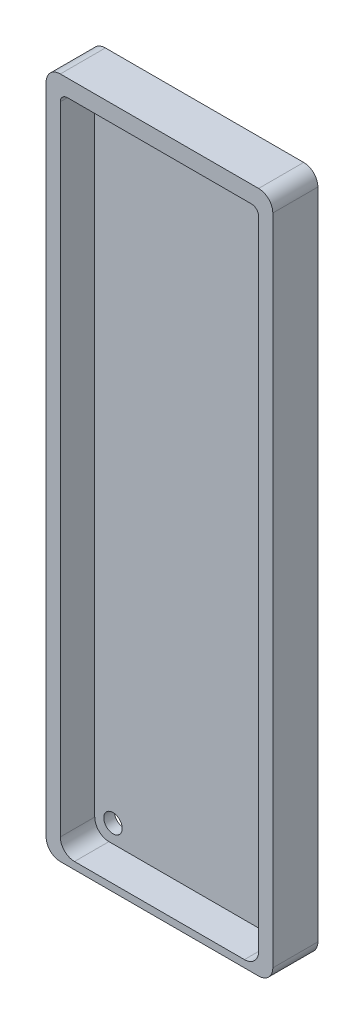
ISO-10303-21;
HEADER;
FILE_DESCRIPTION(('STEP AP214'),'2;1');
FILE_NAME('part.step','',(''),(''),'','','');
FILE_SCHEMA(('AUTOMOTIVE_DESIGN { 1 0 10303 214 1 1 1 1 }'));
ENDSEC;
DATA;
#1=APPLICATION_CONTEXT('core data for automotive mechanical design processes');
#2=APPLICATION_PROTOCOL_DEFINITION('international standard','automotive_design',2000,#1);
#3=PRODUCT_CONTEXT('',#1,'mechanical');
#4=PRODUCT('Part','Part','',(#3));
#5=PRODUCT_RELATED_PRODUCT_CATEGORY('part','',(#4));
#6=PRODUCT_DEFINITION_FORMATION('','',#4);
#7=PRODUCT_DEFINITION_CONTEXT('part definition',#1,'design');
#8=PRODUCT_DEFINITION('design','',#6,#7);
#9=PRODUCT_DEFINITION_SHAPE('','',#8);
#10=(LENGTH_UNIT() NAMED_UNIT(*) SI_UNIT(.MILLI.,.METRE.));
#11=(NAMED_UNIT(*) PLANE_ANGLE_UNIT() SI_UNIT($,.RADIAN.));
#12=(NAMED_UNIT(*) SI_UNIT($,.STERADIAN.) SOLID_ANGLE_UNIT());
#13=UNCERTAINTY_MEASURE_WITH_UNIT(LENGTH_MEASURE(1.E-05),#10,'distance_accuracy_value','');
#14=(GEOMETRIC_REPRESENTATION_CONTEXT(3) GLOBAL_UNCERTAINTY_ASSIGNED_CONTEXT((#13)) GLOBAL_UNIT_ASSIGNED_CONTEXT((#10,
#11,#12)) REPRESENTATION_CONTEXT('',''));
#15=CARTESIAN_POINT('',(0.,0.,0.));
#16=DIRECTION('',(0.,0.,1.));
#17=DIRECTION('',(1.,0.,0.));
#18=AXIS2_PLACEMENT_3D('',#15,#16,#17);
#19=CARTESIAN_POINT('',(82.55,-34.543931,107.629295880141));
#20=DIRECTION('',(-1.,0.,0.));
#21=DIRECTION('',(0.,0.,1.));
#22=AXIS2_PLACEMENT_3D('',#19,#20,#21);
#23=PLANE('',#22);
#24=DIRECTION('',(0.,0.,-1.));
#25=VECTOR('',#24,1.);
#26=CARTESIAN_POINT('',(82.55,-124.253931,107.629295880141));
#27=LINE('',#26,#25);
#28=CARTESIAN_POINT('',(82.55,-124.253931,6.34999999999999));
#29=VERTEX_POINT('',#28);
#30=CARTESIAN_POINT('',(82.55,-124.253931,1.5));
#31=VERTEX_POINT('',#30);
#32=EDGE_CURVE('E280',#29,#31,#27,.T.);
#33=ORIENTED_EDGE('',*,*,#32,.T.);
#34=DIRECTION('',(0.,-1.,0.));
#35=VECTOR('',#34,1.);
#36=CARTESIAN_POINT('',(82.55,-38.623931,1.5));
#37=LINE('',#36,#35);
#38=CARTESIAN_POINT('',(82.55,-34.543931,1.5));
#39=VERTEX_POINT('',#38);
#40=EDGE_CURVE('E58',#39,#31,#37,.T.);
#41=ORIENTED_EDGE('',*,*,#40,.F.);
#42=DIRECTION('',(0.,0.,-1.));
#43=VECTOR('',#42,1.);
#44=CARTESIAN_POINT('',(82.55,-34.543931,107.629295880141));
#45=LINE('',#44,#43);
#46=CARTESIAN_POINT('',(82.55,-34.543931,6.34999999999999));
#47=VERTEX_POINT('',#46);
#48=EDGE_CURVE('E289',#47,#39,#45,.T.);
#49=ORIENTED_EDGE('',*,*,#48,.F.);
#50=DIRECTION('',(0.,-1.,0.));
#51=VECTOR('',#50,1.);
#52=CARTESIAN_POINT('',(82.55,-34.543931,6.34999999999999));
#53=LINE('',#52,#51);
#54=EDGE_CURVE('E287',#47,#29,#53,.T.);
#55=ORIENTED_EDGE('',*,*,#54,.T.);
#56=EDGE_LOOP('',(#33,#41,#49,#55));
#57=FACE_BOUND('',#56,.T.);
#58=ADVANCED_FACE('F36',(#57),#23,.F.);
#59=CARTESIAN_POINT('',(108.49,-126.253931,107.629295880141));
#60=DIRECTION('',(0.,-1.,0.));
#61=DIRECTION('',(0.,0.,-1.));
#62=AXIS2_PLACEMENT_3D('',#59,#60,#61);
#63=PLANE('',#62);
#64=DIRECTION('',(0.,0.,-1.));
#65=VECTOR('',#64,1.);
#66=CARTESIAN_POINT('',(108.49,-126.253931,107.629295880141));
#67=LINE('',#66,#65);
#68=CARTESIAN_POINT('',(108.49,-126.253931,6.34999999999999));
#69=VERTEX_POINT('',#68);
#70=CARTESIAN_POINT('',(108.49,-126.253931,1.5));
#71=VERTEX_POINT('',#70);
#72=EDGE_CURVE('E296',#69,#71,#67,.T.);
#73=ORIENTED_EDGE('',*,*,#72,.T.);
#74=DIRECTION('',(1.,0.,0.));
#75=VECTOR('',#74,1.);
#76=CARTESIAN_POINT('',(85.09,-126.253931,1.5));
#77=LINE('',#76,#75);
#78=CARTESIAN_POINT('',(84.55,-126.253931,1.5));
#79=VERTEX_POINT('',#78);
#80=EDGE_CURVE('E53',#79,#71,#77,.T.);
#81=ORIENTED_EDGE('',*,*,#80,.F.);
#82=DIRECTION('',(0.,0.,-1.));
#83=VECTOR('',#82,1.);
#84=CARTESIAN_POINT('',(84.55,-126.253931,107.629295880141));
#85=LINE('',#84,#83);
#86=CARTESIAN_POINT('',(84.55,-126.253931,6.34999999999999));
#87=VERTEX_POINT('',#86);
#88=EDGE_CURVE('E283',#87,#79,#85,.T.);
#89=ORIENTED_EDGE('',*,*,#88,.F.);
#90=DIRECTION('',(1.,0.,0.));
#91=VECTOR('',#90,1.);
#92=CARTESIAN_POINT('',(108.49,-126.253931,6.34999999999999));
#93=LINE('',#92,#91);
#94=EDGE_CURVE('E434',#87,#69,#93,.T.);
#95=ORIENTED_EDGE('',*,*,#94,.T.);
#96=EDGE_LOOP('',(#73,#81,#89,#95));
#97=FACE_BOUND('',#96,.T.);
#98=ADVANCED_FACE('F451',(#97),#63,.F.);
#99=CARTESIAN_POINT('',(84.55,-124.253931,107.629295880141));
#100=DIRECTION('',(0.,0.,-1.));
#101=DIRECTION('',(-1.,0.,0.));
#102=AXIS2_PLACEMENT_3D('',#99,#100,#101);
#103=CYLINDRICAL_SURFACE('',#102,2.);
#104=CARTESIAN_POINT('',(84.55,-124.253931,1.5));
#105=DIRECTION('',(0.,0.,-1.));
#106=DIRECTION('',(-1.,0.,0.));
#107=AXIS2_PLACEMENT_3D('',#104,#105,#106);
#108=CIRCLE('',#107,2.);
#109=EDGE_CURVE('E46',#31,#79,#108,.F.);
#110=ORIENTED_EDGE('',*,*,#109,.F.);
#111=ORIENTED_EDGE('',*,*,#32,.F.);
#112=CARTESIAN_POINT('',(84.55,-124.253931,6.34999999999999));
#113=DIRECTION('',(0.,0.,-1.));
#114=DIRECTION('',(-1.,0.,0.));
#115=AXIS2_PLACEMENT_3D('',#112,#113,#114);
#116=CIRCLE('',#115,2.);
#117=EDGE_CURVE('E438',#29,#87,#116,.F.);
#118=ORIENTED_EDGE('',*,*,#117,.T.);
#119=ORIENTED_EDGE('',*,*,#88,.T.);
#120=EDGE_LOOP('',(#110,#111,#118,#119));
#121=FACE_BOUND('',#120,.T.);
#122=ADVANCED_FACE('F278',(#121),#103,.F.);
#123=CARTESIAN_POINT('',(109.49,-33.543931,107.629295880141));
#124=DIRECTION('',(0.,1.,0.));
#125=DIRECTION('',(0.,0.,1.));
#126=AXIS2_PLACEMENT_3D('',#123,#124,#125);
#127=PLANE('',#126);
#128=DIRECTION('',(-1.,0.,0.));
#129=VECTOR('',#128,1.);
#130=CARTESIAN_POINT('',(83.82,-33.543931,1.5));
#131=LINE('',#130,#129);
#132=CARTESIAN_POINT('',(109.49,-33.543931,1.5));
#133=VERTEX_POINT('',#132);
#134=CARTESIAN_POINT('',(83.55,-33.543931,1.5));
#135=VERTEX_POINT('',#134);
#136=EDGE_CURVE('E234',#133,#135,#131,.T.);
#137=ORIENTED_EDGE('',*,*,#136,.F.);
#138=DIRECTION('',(0.,0.,-1.));
#139=VECTOR('',#138,1.);
#140=CARTESIAN_POINT('',(109.49,-33.543931,107.629295880141));
#141=LINE('',#140,#139);
#142=CARTESIAN_POINT('',(109.49,-33.543931,6.34999999999999));
#143=VERTEX_POINT('',#142);
#144=EDGE_CURVE('E311',#143,#133,#141,.T.);
#145=ORIENTED_EDGE('',*,*,#144,.F.);
#146=DIRECTION('',(-1.,0.,0.));
#147=VECTOR('',#146,1.);
#148=CARTESIAN_POINT('',(109.49,-33.543931,6.34999999999999));
#149=LINE('',#148,#147);
#150=CARTESIAN_POINT('',(83.55,-33.543931,6.34999999999999));
#151=VERTEX_POINT('',#150);
#152=EDGE_CURVE('E352',#143,#151,#149,.T.);
#153=ORIENTED_EDGE('',*,*,#152,.T.);
#154=DIRECTION('',(0.,0.,-1.));
#155=VECTOR('',#154,1.);
#156=CARTESIAN_POINT('',(83.55,-33.543931,107.629295880141));
#157=LINE('',#156,#155);
#158=EDGE_CURVE('E315',#151,#135,#157,.T.);
#159=ORIENTED_EDGE('',*,*,#158,.T.);
#160=EDGE_LOOP('',(#137,#145,#153,#159));
#161=FACE_BOUND('',#160,.T.);
#162=ADVANCED_FACE('F479',(#161),#127,.F.);
#163=CARTESIAN_POINT('',(83.55,-34.543931,107.629295880141));
#164=DIRECTION('',(0.,0.,-1.));
#165=DIRECTION('',(-1.,0.,0.));
#166=AXIS2_PLACEMENT_3D('',#163,#164,#165);
#167=CYLINDRICAL_SURFACE('',#166,1.);
#168=CARTESIAN_POINT('',(83.55,-34.543931,1.5));
#169=DIRECTION('',(0.,0.,-1.));
#170=DIRECTION('',(-1.,0.,0.));
#171=AXIS2_PLACEMENT_3D('',#168,#169,#170);
#172=CIRCLE('',#171,1.);
#173=EDGE_CURVE('E259',#135,#39,#172,.F.);
#174=ORIENTED_EDGE('',*,*,#173,.F.);
#175=ORIENTED_EDGE('',*,*,#158,.F.);
#176=CARTESIAN_POINT('',(83.55,-34.543931,6.34999999999999));
#177=DIRECTION('',(0.,0.,-1.));
#178=DIRECTION('',(-1.,0.,0.));
#179=AXIS2_PLACEMENT_3D('',#176,#177,#178);
#180=CIRCLE('',#179,1.);
#181=EDGE_CURVE('E402',#151,#47,#180,.F.);
#182=ORIENTED_EDGE('',*,*,#181,.T.);
#183=ORIENTED_EDGE('',*,*,#48,.T.);
#184=EDGE_LOOP('',(#174,#175,#182,#183));
#185=FACE_BOUND('',#184,.T.);
#186=ADVANCED_FACE('F446',(#185),#167,.F.);
#187=CARTESIAN_POINT('',(110.393327125,-34.32792275,1.5));
#188=DIRECTION('',(0.,0.,-1.));
#189=DIRECTION('',(-1.,0.,0.));
#190=AXIS2_PLACEMENT_3D('',#187,#188,#189);
#191=PLANE('',#190);
#192=CARTESIAN_POINT('',(107.979999813124,-123.713233950328,1.5));
#193=DIRECTION('',(0.,0.,-1.));
#194=DIRECTION('',(-1.,0.,0.));
#195=AXIS2_PLACEMENT_3D('',#192,#193,#194);
#196=CIRCLE('',#195,1.29999999999999);
#197=CARTESIAN_POINT('',(106.679999813124,-123.713233950328,1.5));
#198=VERTEX_POINT('',#197);
#199=EDGE_CURVE('E750',#198,#198,#196,.T.);
#200=ORIENTED_EDGE('',*,*,#199,.T.);
#201=EDGE_LOOP('',(#200));
#202=FACE_BOUND('',#201,.T.);
#203=CARTESIAN_POINT('',(85.1199998263481,-123.71325906623,1.5));
#204=DIRECTION('',(0.,0.,-1.));
#205=DIRECTION('',(-1.,0.,0.));
#206=AXIS2_PLACEMENT_3D('',#203,#204,#205);
#207=CIRCLE('',#206,1.29999999999999);
#208=CARTESIAN_POINT('',(83.8199998263481,-123.71325906623,1.5));
#209=VERTEX_POINT('',#208);
#210=EDGE_CURVE('E752',#209,#209,#207,.T.);
#211=ORIENTED_EDGE('',*,*,#210,.T.);
#212=EDGE_LOOP('',(#211));
#213=FACE_BOUND('',#212,.T.);
#214=CARTESIAN_POINT('',(107.952359107952,-36.0805207525802,1.5));
#215=DIRECTION('',(0.,0.,-1.));
#216=DIRECTION('',(-1.,0.,0.));
#217=AXIS2_PLACEMENT_3D('',#214,#215,#216);
#218=CIRCLE('',#217,1.29999999999999);
#219=CARTESIAN_POINT('',(106.652359107952,-36.0805207525802,1.5));
#220=VERTEX_POINT('',#219);
#221=EDGE_CURVE('E191',#220,#220,#218,.T.);
#222=ORIENTED_EDGE('',*,*,#221,.T.);
#223=EDGE_LOOP('',(#222));
#224=FACE_BOUND('',#223,.T.);
#225=DIRECTION('',(0.,1.,0.));
#226=VECTOR('',#225,1.);
#227=CARTESIAN_POINT('',(110.49,-39.893931,1.5));
#228=LINE('',#227,#226);
#229=CARTESIAN_POINT('',(110.49,-124.253931,1.5));
#230=VERTEX_POINT('',#229);
#231=CARTESIAN_POINT('',(110.49,-34.813931,1.5));
#232=VERTEX_POINT('',#231);
#233=EDGE_CURVE('E244',#230,#232,#228,.T.);
#234=ORIENTED_EDGE('',*,*,#233,.T.);
#235=CARTESIAN_POINT('',(110.49,-34.813931,1.5));
#236=CARTESIAN_POINT('',(110.49,-34.477106,1.5));
#237=CARTESIAN_POINT('',(110.356197,-34.154076,1.5));
#238=CARTESIAN_POINT('',(110.118026,-33.915905,1.5));
#239=B_SPLINE_CURVE_WITH_KNOTS('',3,(#235,#236,#237,#238),.UNSPECIFIED.,.F.,.F.,(4,4),(0.,1.),.UNSPECIFIED.);
#240=CARTESIAN_POINT('',(110.489698576368,-34.7862458612369,1.5));
#241=VERTEX_POINT('',#240);
#242=EDGE_CURVE('E227',#232,#241,#239,.T.);
#243=ORIENTED_EDGE('',*,*,#242,.T.);
#244=DIRECTION('',(1.,0.,0.));
#245=VECTOR('',#244,1.);
#246=CARTESIAN_POINT('',(108.639688753445,-34.7862458612369,1.5));
#247=LINE('',#246,#245);
#248=CARTESIAN_POINT('',(110.49,-34.7862458612369,1.5));
#249=VERTEX_POINT('',#248);
#250=EDGE_CURVE('E766',#241,#249,#247,.T.);
#251=ORIENTED_EDGE('',*,*,#250,.T.);
#252=DIRECTION('',(0.,-1.,0.));
#253=VECTOR('',#252,1.);
#254=CARTESIAN_POINT('',(110.49,-34.543931,1.5));
#255=LINE('',#254,#253);
#256=CARTESIAN_POINT('',(110.49,-34.543931,1.5));
#257=VERTEX_POINT('',#256);
#258=EDGE_CURVE('E266',#257,#249,#255,.T.);
#259=ORIENTED_EDGE('',*,*,#258,.F.);
#260=CARTESIAN_POINT('',(109.49,-34.543931,1.5));
#261=DIRECTION('',(0.,0.,1.));
#262=DIRECTION('',(1.,0.,0.));
#263=AXIS2_PLACEMENT_3D('',#260,#261,#262);
#264=CIRCLE('',#263,1.);
#265=EDGE_CURVE('E404',#133,#257,#264,.F.);
#266=ORIENTED_EDGE('',*,*,#265,.F.);
#267=ORIENTED_EDGE('',*,*,#136,.T.);
#268=ORIENTED_EDGE('',*,*,#173,.T.);
#269=ORIENTED_EDGE('',*,*,#40,.T.);
#270=ORIENTED_EDGE('',*,*,#109,.T.);
#271=ORIENTED_EDGE('',*,*,#80,.T.);
#272=CARTESIAN_POINT('',(108.49,-124.253931,1.5));
#273=DIRECTION('',(0.,0.,1.));
#274=DIRECTION('',(1.,0.,0.));
#275=AXIS2_PLACEMENT_3D('',#272,#273,#274);
#276=CIRCLE('',#275,2.);
#277=EDGE_CURVE('E11',#230,#71,#276,.F.);
#278=ORIENTED_EDGE('',*,*,#277,.F.);
#279=EDGE_LOOP('',(#234,#243,#251,#259,#266,#267,#268,#269,#270,#271,#278));
#280=FACE_BOUND('',#279,.T.);
#281=CARTESIAN_POINT('',(84.455,-34.984079,1.5));
#282=CARTESIAN_POINT('',(84.062061,-35.210942,1.5));
#283=CARTESIAN_POINT('',(83.82,-35.630204,1.5));
#284=CARTESIAN_POINT('',(83.82,-36.083931,1.5));
#285=B_SPLINE_CURVE_WITH_KNOTS('',3,(#281,#282,#283,#284),.UNSPECIFIED.,.F.,.F.,(4,4),(0.,1.),.UNSPECIFIED.);
#286=CARTESIAN_POINT('',(83.8260684732992,-35.9597711771851,1.5));
#287=VERTEX_POINT('',#286);
#288=CARTESIAN_POINT('',(83.82,-36.083931,1.5));
#289=VERTEX_POINT('',#288);
#290=EDGE_CURVE('E205',#287,#289,#285,.T.);
#291=ORIENTED_EDGE('',*,*,#290,.F.);
#292=CARTESIAN_POINT('',(85.1199993390039,-36.0852419497841,1.5));
#293=DIRECTION('',(0.,0.,-1.));
#294=DIRECTION('',(-1.,0.,0.));
#295=AXIS2_PLACEMENT_3D('',#292,#293,#294);
#296=CIRCLE('',#295,1.29999999999999);
#297=EDGE_CURVE('E185',#287,#289,#296,.T.);
#298=ORIENTED_EDGE('',*,*,#297,.T.);
#299=EDGE_LOOP('',(#291,#298));
#300=FACE_BOUND('',#299,.T.);
#301=ADVANCED_FACE('F272',(#202,#213,#224,#280,#300),#191,.F.);
#302=CARTESIAN_POINT('',(110.393327125,-34.32792275,0.));
#303=DIRECTION('',(0.,0.,-1.));
#304=DIRECTION('',(-1.,0.,0.));
#305=AXIS2_PLACEMENT_3D('',#302,#303,#304);
#306=PLANE('',#305);
#307=CARTESIAN_POINT('',(85.1199993390039,-36.0852419497841,0.));
#308=DIRECTION('',(0.,0.,-1.));
#309=DIRECTION('',(-1.,0.,0.));
#310=AXIS2_PLACEMENT_3D('',#307,#308,#309);
#311=CIRCLE('',#310,1.29999999999999);
#312=CARTESIAN_POINT('',(83.826068473299,-35.9597711771873,0.));
#313=VERTEX_POINT('',#312);
#314=CARTESIAN_POINT('',(83.82,-36.083931,0.));
#315=VERTEX_POINT('',#314);
#316=EDGE_CURVE('E182',#313,#315,#311,.T.);
#317=ORIENTED_EDGE('',*,*,#316,.F.);
#318=CARTESIAN_POINT('',(84.455,-34.984079,0.));
#319=CARTESIAN_POINT('',(84.062061,-35.210942,0.));
#320=CARTESIAN_POINT('',(83.82,-35.630204,0.));
#321=CARTESIAN_POINT('',(83.82,-36.083931,0.));
#322=B_SPLINE_CURVE_WITH_KNOTS('',3,(#318,#319,#320,#321),.UNSPECIFIED.,.F.,.F.,(4,4),(0.,1.),.UNSPECIFIED.);
#323=EDGE_CURVE('E196',#313,#315,#322,.T.);
#324=ORIENTED_EDGE('',*,*,#323,.T.);
#325=EDGE_LOOP('',(#317,#324));
#326=FACE_BOUND('',#325,.T.);
#327=CARTESIAN_POINT('',(107.979999813124,-123.713233950328,0.));
#328=DIRECTION('',(0.,0.,-1.));
#329=DIRECTION('',(-1.,0.,0.));
#330=AXIS2_PLACEMENT_3D('',#327,#328,#329);
#331=CIRCLE('',#330,1.29999999999999);
#332=CARTESIAN_POINT('',(106.679999813124,-123.713233950328,0.));
#333=VERTEX_POINT('',#332);
#334=EDGE_CURVE('E200',#333,#333,#331,.T.);
#335=ORIENTED_EDGE('',*,*,#334,.F.);
#336=EDGE_LOOP('',(#335));
#337=FACE_BOUND('',#336,.T.);
#338=CARTESIAN_POINT('',(85.1199998263481,-123.71325906623,0.));
#339=DIRECTION('',(0.,0.,-1.));
#340=DIRECTION('',(-1.,0.,0.));
#341=AXIS2_PLACEMENT_3D('',#338,#339,#340);
#342=CIRCLE('',#341,1.29999999999999);
#343=CARTESIAN_POINT('',(83.8199998263481,-123.71325906623,0.));
#344=VERTEX_POINT('',#343);
#345=EDGE_CURVE('E797',#344,#344,#342,.T.);
#346=ORIENTED_EDGE('',*,*,#345,.F.);
#347=EDGE_LOOP('',(#346));
#348=FACE_BOUND('',#347,.T.);
#349=CARTESIAN_POINT('',(107.952359107952,-36.0805207525802,0.));
#350=DIRECTION('',(0.,0.,-1.));
#351=DIRECTION('',(-1.,0.,0.));
#352=AXIS2_PLACEMENT_3D('',#349,#350,#351);
#353=CIRCLE('',#352,1.29999999999999);
#354=CARTESIAN_POINT('',(106.652359107952,-36.0805207525802,0.));
#355=VERTEX_POINT('',#354);
#356=EDGE_CURVE('E199',#355,#355,#353,.T.);
#357=ORIENTED_EDGE('',*,*,#356,.F.);
#358=EDGE_LOOP('',(#357));
#359=FACE_BOUND('',#358,.T.);
#360=DIRECTION('',(0.,-1.,0.));
#361=VECTOR('',#360,1.);
#362=CARTESIAN_POINT('',(110.49,-34.543931,0.));
#363=LINE('',#362,#361);
#364=CARTESIAN_POINT('',(110.49,-34.7862458612369,0.));
#365=VERTEX_POINT('',#364);
#366=CARTESIAN_POINT('',(110.49,-34.813931,0.));
#367=VERTEX_POINT('',#366);
#368=EDGE_CURVE('E319',#365,#367,#363,.T.);
#369=ORIENTED_EDGE('',*,*,#368,.F.);
#370=DIRECTION('',(1.,0.,0.));
#371=VECTOR('',#370,1.);
#372=CARTESIAN_POINT('',(108.639688753445,-34.7862458612369,0.));
#373=LINE('',#372,#371);
#374=CARTESIAN_POINT('',(110.489698576368,-34.7862458612369,0.));
#375=VERTEX_POINT('',#374);
#376=EDGE_CURVE('E420',#375,#365,#373,.T.);
#377=ORIENTED_EDGE('',*,*,#376,.F.);
#378=CARTESIAN_POINT('',(110.49,-34.813931,0.));
#379=CARTESIAN_POINT('',(110.49,-34.477106,0.));
#380=CARTESIAN_POINT('',(110.356197,-34.154076,0.));
#381=CARTESIAN_POINT('',(110.118026,-33.915905,0.));
#382=B_SPLINE_CURVE_WITH_KNOTS('',3,(#378,#379,#380,#381),.UNSPECIFIED.,.F.,.F.,(4,4),(0.,1.),.UNSPECIFIED.);
#383=EDGE_CURVE('E226',#367,#375,#382,.T.);
#384=ORIENTED_EDGE('',*,*,#383,.F.);
#385=EDGE_LOOP('',(#369,#377,#384));
#386=FACE_BOUND('',#385,.T.);
#387=CARTESIAN_POINT('',(110.49,-33.1528901463233,0.));
#388=DIRECTION('',(0.,0.,-1.));
#389=DIRECTION('',(1.,0.,0.));
#390=AXIS2_PLACEMENT_3D('',#387,#388,#389);
#391=CIRCLE('',#390,2.);
#392=CARTESIAN_POINT('',(110.49,-31.1528901463232,0.));
#393=VERTEX_POINT('',#392);
#394=CARTESIAN_POINT('',(112.49,-33.1528901463233,0.));
#395=VERTEX_POINT('',#394);
#396=EDGE_CURVE('E293',#393,#395,#391,.T.);
#397=ORIENTED_EDGE('',*,*,#396,.T.);
#398=DIRECTION('',(0.,-1.,0.));
#399=VECTOR('',#398,1.);
#400=CARTESIAN_POINT('',(112.49,-33.1528901463233,0.));
#401=LINE('',#400,#399);
#402=CARTESIAN_POINT('',(112.49,-125.263931,0.));
#403=VERTEX_POINT('',#402);
#404=EDGE_CURVE('E323',#395,#403,#401,.T.);
#405=ORIENTED_EDGE('',*,*,#404,.T.);
#406=CARTESIAN_POINT('',(110.49,-125.263931,0.));
#407=DIRECTION('',(0.,0.,-1.));
#408=DIRECTION('',(-1.,0.,0.));
#409=AXIS2_PLACEMENT_3D('',#406,#407,#408);
#410=CIRCLE('',#409,2.);
#411=CARTESIAN_POINT('',(110.49,-127.263931,0.));
#412=VERTEX_POINT('',#411);
#413=EDGE_CURVE('E327',#403,#412,#410,.T.);
#414=ORIENTED_EDGE('',*,*,#413,.T.);
#415=DIRECTION('',(-1.,0.,0.));
#416=VECTOR('',#415,1.);
#417=CARTESIAN_POINT('',(110.49,-127.263931,0.));
#418=LINE('',#417,#416);
#419=CARTESIAN_POINT('',(82.5500000000001,-127.263931,0.));
#420=VERTEX_POINT('',#419);
#421=EDGE_CURVE('E330',#412,#420,#418,.T.);
#422=ORIENTED_EDGE('',*,*,#421,.T.);
#423=CARTESIAN_POINT('',(82.5500000000001,-125.263931,0.));
#424=DIRECTION('',(0.,0.,-1.));
#425=DIRECTION('',(-1.,0.,0.));
#426=AXIS2_PLACEMENT_3D('',#423,#424,#425);
#427=CIRCLE('',#426,2.);
#428=CARTESIAN_POINT('',(80.5500000000001,-125.263931,0.));
#429=VERTEX_POINT('',#428);
#430=EDGE_CURVE('E334',#420,#429,#427,.T.);
#431=ORIENTED_EDGE('',*,*,#430,.T.);
#432=DIRECTION('',(0.,1.,0.));
#433=VECTOR('',#432,1.);
#434=CARTESIAN_POINT('',(80.5500000000001,-33.1528901463233,0.));
#435=LINE('',#434,#433);
#436=CARTESIAN_POINT('',(80.5500000000001,-33.1528901463233,0.));
#437=VERTEX_POINT('',#436);
#438=EDGE_CURVE('E337',#429,#437,#435,.T.);
#439=ORIENTED_EDGE('',*,*,#438,.T.);
#440=CARTESIAN_POINT('',(82.5500000000001,-33.1528901463233,0.));
#441=DIRECTION('',(0.,0.,-1.));
#442=DIRECTION('',(-1.,0.,0.));
#443=AXIS2_PLACEMENT_3D('',#440,#441,#442);
#444=CIRCLE('',#443,2.);
#445=CARTESIAN_POINT('',(82.5500000000001,-31.1528901463232,0.));
#446=VERTEX_POINT('',#445);
#447=EDGE_CURVE('E340',#437,#446,#444,.T.);
#448=ORIENTED_EDGE('',*,*,#447,.T.);
#449=DIRECTION('',(1.,0.,0.));
#450=VECTOR('',#449,1.);
#451=CARTESIAN_POINT('',(110.49,-31.1528901463232,0.));
#452=LINE('',#451,#450);
#453=EDGE_CURVE('E344',#446,#393,#452,.T.);
#454=ORIENTED_EDGE('',*,*,#453,.T.);
#455=EDGE_LOOP('',(#397,#405,#414,#422,#431,#439,#448,#454));
#456=FACE_BOUND('',#455,.T.);
#457=ADVANCED_FACE('F194',(#326,#337,#348,#359,#386,#456),#306,.T.);
#458=DIRECTION('',(0.,0.,-1.));
#459=VECTOR('',#458,1.);
#460=SURFACE_OF_LINEAR_EXTRUSION('',#239,#459);
#461=ORIENTED_EDGE('',*,*,#383,.T.);
#462=DIRECTION('',(0.,0.,-1.));
#463=VECTOR('',#462,1.);
#464=CARTESIAN_POINT('',(110.489698576368,-34.7862458612368,1.5));
#465=LINE('',#464,#463);
#466=EDGE_CURVE('E412',#375,#241,#465,.F.);
#467=ORIENTED_EDGE('',*,*,#466,.T.);
#468=ORIENTED_EDGE('',*,*,#242,.F.);
#469=DIRECTION('',(0.,0.,-1.));
#470=VECTOR('',#469,1.);
#471=CARTESIAN_POINT('',(110.49,-34.813931,1.5));
#472=LINE('',#471,#470);
#473=EDGE_CURVE('E247',#232,#367,#472,.T.);
#474=ORIENTED_EDGE('',*,*,#473,.T.);
#475=EDGE_LOOP('',(#461,#467,#468,#474));
#476=FACE_BOUND('',#475,.T.);
#477=ADVANCED_FACE('F38',(#476),#460,.F.);
#478=DIRECTION('',(0.,0.,-1.));
#479=VECTOR('',#478,1.);
#480=SURFACE_OF_LINEAR_EXTRUSION('',#285,#479);
#481=DIRECTION('',(0.,0.,-1.));
#482=VECTOR('',#481,1.);
#483=CARTESIAN_POINT('',(83.8260684732992,-35.9597711771851,1.5));
#484=LINE('',#483,#482);
#485=EDGE_CURVE('E179',#287,#313,#484,.T.);
#486=ORIENTED_EDGE('',*,*,#485,.F.);
#487=ORIENTED_EDGE('',*,*,#290,.T.);
#488=DIRECTION('',(0.,0.,-1.));
#489=VECTOR('',#488,1.);
#490=CARTESIAN_POINT('',(83.82,-36.083931,1.5));
#491=LINE('',#490,#489);
#492=EDGE_CURVE('E203',#289,#315,#491,.T.);
#493=ORIENTED_EDGE('',*,*,#492,.T.);
#494=ORIENTED_EDGE('',*,*,#323,.F.);
#495=EDGE_LOOP('',(#486,#487,#493,#494));
#496=FACE_BOUND('',#495,.T.);
#497=ADVANCED_FACE('F202',(#496),#480,.T.);
#498=CARTESIAN_POINT('',(112.49,-33.1528901463233,107.629295880141));
#499=DIRECTION('',(1.,0.,0.));
#500=DIRECTION('',(0.,0.,-1.));
#501=AXIS2_PLACEMENT_3D('',#498,#499,#500);
#502=PLANE('',#501);
#503=DIRECTION('',(0.,1.,0.));
#504=VECTOR('',#503,1.);
#505=CARTESIAN_POINT('',(112.49,-33.1528901463233,6.34999999999999));
#506=LINE('',#505,#504);
#507=CARTESIAN_POINT('',(112.49,-125.263931,6.34999999999999));
#508=VERTEX_POINT('',#507);
#509=CARTESIAN_POINT('',(112.49,-33.1528901463233,6.34999999999999));
#510=VERTEX_POINT('',#509);
#511=EDGE_CURVE('E206',#508,#510,#506,.T.);
#512=ORIENTED_EDGE('',*,*,#511,.F.);
#513=DIRECTION('',(0.,0.,-1.));
#514=VECTOR('',#513,1.);
#515=CARTESIAN_POINT('',(112.49,-125.263931,107.629295880141));
#516=LINE('',#515,#514);
#517=EDGE_CURVE('E367',#508,#403,#516,.T.);
#518=ORIENTED_EDGE('',*,*,#517,.T.);
#519=ORIENTED_EDGE('',*,*,#404,.F.);
#520=DIRECTION('',(0.,0.,-1.));
#521=VECTOR('',#520,1.);
#522=CARTESIAN_POINT('',(112.49,-33.1528901463233,107.629295880141));
#523=LINE('',#522,#521);
#524=EDGE_CURVE('E348',#510,#395,#523,.T.);
#525=ORIENTED_EDGE('',*,*,#524,.F.);
#526=EDGE_LOOP('',(#512,#518,#519,#525));
#527=FACE_BOUND('',#526,.T.);
#528=ADVANCED_FACE('F512',(#527),#502,.T.);
#529=CARTESIAN_POINT('',(110.49,-125.263931,107.629295880141));
#530=DIRECTION('',(0.,0.,-1.));
#531=DIRECTION('',(-1.,0.,0.));
#532=AXIS2_PLACEMENT_3D('',#529,#530,#531);
#533=CYLINDRICAL_SURFACE('',#532,2.);
#534=CARTESIAN_POINT('',(110.49,-125.263931,6.34999999999999));
#535=DIRECTION('',(0.,0.,-1.));
#536=DIRECTION('',(-1.,0.,0.));
#537=AXIS2_PLACEMENT_3D('',#534,#535,#536);
#538=CIRCLE('',#537,2.);
#539=CARTESIAN_POINT('',(110.49,-127.263931,6.34999999999999));
#540=VERTEX_POINT('',#539);
#541=EDGE_CURVE('E373',#540,#508,#538,.F.);
#542=ORIENTED_EDGE('',*,*,#541,.F.);
#543=DIRECTION('',(0.,0.,-1.));
#544=VECTOR('',#543,1.);
#545=CARTESIAN_POINT('',(110.49,-127.263931,107.629295880141));
#546=LINE('',#545,#544);
#547=EDGE_CURVE('E365',#540,#412,#546,.T.);
#548=ORIENTED_EDGE('',*,*,#547,.T.);
#549=ORIENTED_EDGE('',*,*,#413,.F.);
#550=ORIENTED_EDGE('',*,*,#517,.F.);
#551=EDGE_LOOP('',(#542,#548,#549,#550));
#552=FACE_BOUND('',#551,.T.);
#553=ADVANCED_FACE('F508',(#552),#533,.T.);
#554=CARTESIAN_POINT('',(110.49,-127.263931,107.629295880141));
#555=DIRECTION('',(0.,-1.,0.));
#556=DIRECTION('',(0.,0.,-1.));
#557=AXIS2_PLACEMENT_3D('',#554,#555,#556);
#558=PLANE('',#557);
#559=DIRECTION('',(1.,0.,0.));
#560=VECTOR('',#559,1.);
#561=CARTESIAN_POINT('',(110.49,-127.263931,6.34999999999999));
#562=LINE('',#561,#560);
#563=CARTESIAN_POINT('',(82.5500000000001,-127.263931,6.34999999999999));
#564=VERTEX_POINT('',#563);
#565=EDGE_CURVE('E378',#564,#540,#562,.T.);
#566=ORIENTED_EDGE('',*,*,#565,.F.);
#567=DIRECTION('',(0.,0.,-1.));
#568=VECTOR('',#567,1.);
#569=CARTESIAN_POINT('',(82.5500000000001,-127.263931,107.629295880141));
#570=LINE('',#569,#568);
#571=EDGE_CURVE('E362',#564,#420,#570,.T.);
#572=ORIENTED_EDGE('',*,*,#571,.T.);
#573=ORIENTED_EDGE('',*,*,#421,.F.);
#574=ORIENTED_EDGE('',*,*,#547,.F.);
#575=EDGE_LOOP('',(#566,#572,#573,#574));
#576=FACE_BOUND('',#575,.T.);
#577=ADVANCED_FACE('F504',(#576),#558,.T.);
#578=CARTESIAN_POINT('',(82.5500000000001,-125.263931,107.629295880141));
#579=DIRECTION('',(0.,0.,-1.));
#580=DIRECTION('',(-1.,0.,0.));
#581=AXIS2_PLACEMENT_3D('',#578,#579,#580);
#582=CYLINDRICAL_SURFACE('',#581,2.);
#583=CARTESIAN_POINT('',(82.5500000000001,-125.263931,6.34999999999999));
#584=DIRECTION('',(0.,0.,-1.));
#585=DIRECTION('',(-1.,0.,0.));
#586=AXIS2_PLACEMENT_3D('',#583,#584,#585);
#587=CIRCLE('',#586,2.);
#588=CARTESIAN_POINT('',(80.5500000000001,-125.263931,6.34999999999999));
#589=VERTEX_POINT('',#588);
#590=EDGE_CURVE('E385',#589,#564,#587,.F.);
#591=ORIENTED_EDGE('',*,*,#590,.F.);
#592=DIRECTION('',(0.,0.,-1.));
#593=VECTOR('',#592,1.);
#594=CARTESIAN_POINT('',(80.5500000000001,-125.263931,107.629295880141));
#595=LINE('',#594,#593);
#596=EDGE_CURVE('E359',#589,#429,#595,.T.);
#597=ORIENTED_EDGE('',*,*,#596,.T.);
#598=ORIENTED_EDGE('',*,*,#430,.F.);
#599=ORIENTED_EDGE('',*,*,#571,.F.);
#600=EDGE_LOOP('',(#591,#597,#598,#599));
#601=FACE_BOUND('',#600,.T.);
#602=ADVANCED_FACE('F500',(#601),#582,.T.);
#603=CARTESIAN_POINT('',(80.5500000000001,-33.1528901463233,107.629295880141));
#604=DIRECTION('',(-1.,0.,0.));
#605=DIRECTION('',(0.,0.,1.));
#606=AXIS2_PLACEMENT_3D('',#603,#604,#605);
#607=PLANE('',#606);
#608=DIRECTION('',(0.,-1.,0.));
#609=VECTOR('',#608,1.);
#610=CARTESIAN_POINT('',(80.5500000000001,-33.1528901463233,6.34999999999999));
#611=LINE('',#610,#609);
#612=CARTESIAN_POINT('',(80.5500000000001,-33.1528901463233,6.34999999999999));
#613=VERTEX_POINT('',#612);
#614=EDGE_CURVE('E391',#613,#589,#611,.T.);
#615=ORIENTED_EDGE('',*,*,#614,.F.);
#616=DIRECTION('',(0.,0.,-1.));
#617=VECTOR('',#616,1.);
#618=CARTESIAN_POINT('',(80.5500000000001,-33.1528901463233,107.629295880141));
#619=LINE('',#618,#617);
#620=EDGE_CURVE('E356',#613,#437,#619,.T.);
#621=ORIENTED_EDGE('',*,*,#620,.T.);
#622=ORIENTED_EDGE('',*,*,#438,.F.);
#623=ORIENTED_EDGE('',*,*,#596,.F.);
#624=EDGE_LOOP('',(#615,#621,#622,#623));
#625=FACE_BOUND('',#624,.T.);
#626=ADVANCED_FACE('F496',(#625),#607,.T.);
#627=CARTESIAN_POINT('',(82.5500000000001,-33.1528901463233,107.629295880141));
#628=DIRECTION('',(0.,0.,-1.));
#629=DIRECTION('',(-1.,0.,0.));
#630=AXIS2_PLACEMENT_3D('',#627,#628,#629);
#631=CYLINDRICAL_SURFACE('',#630,2.);
#632=CARTESIAN_POINT('',(82.5500000000001,-33.1528901463233,6.34999999999999));
#633=DIRECTION('',(0.,0.,-1.));
#634=DIRECTION('',(-1.,0.,0.));
#635=AXIS2_PLACEMENT_3D('',#632,#633,#634);
#636=CIRCLE('',#635,2.);
#637=CARTESIAN_POINT('',(82.5500000000001,-31.1528901463232,6.34999999999999));
#638=VERTEX_POINT('',#637);
#639=EDGE_CURVE('E394',#638,#613,#636,.F.);
#640=ORIENTED_EDGE('',*,*,#639,.F.);
#641=DIRECTION('',(0.,0.,-1.));
#642=VECTOR('',#641,1.);
#643=CARTESIAN_POINT('',(82.5500000000001,-31.1528901463232,107.629295880141));
#644=LINE('',#643,#642);
#645=EDGE_CURVE('E353',#638,#446,#644,.T.);
#646=ORIENTED_EDGE('',*,*,#645,.T.);
#647=ORIENTED_EDGE('',*,*,#447,.F.);
#648=ORIENTED_EDGE('',*,*,#620,.F.);
#649=EDGE_LOOP('',(#640,#646,#647,#648));
#650=FACE_BOUND('',#649,.T.);
#651=ADVANCED_FACE('F492',(#650),#631,.T.);
#652=CARTESIAN_POINT('',(110.49,-31.1528901463232,107.629295880141));
#653=DIRECTION('',(0.,1.,0.));
#654=DIRECTION('',(0.,0.,1.));
#655=AXIS2_PLACEMENT_3D('',#652,#653,#654);
#656=PLANE('',#655);
#657=DIRECTION('',(-1.,0.,0.));
#658=VECTOR('',#657,1.);
#659=CARTESIAN_POINT('',(110.49,-31.1528901463232,6.34999999999999));
#660=LINE('',#659,#658);
#661=CARTESIAN_POINT('',(110.49,-31.1528901463232,6.34999999999999));
#662=VERTEX_POINT('',#661);
#663=EDGE_CURVE('E397',#662,#638,#660,.T.);
#664=ORIENTED_EDGE('',*,*,#663,.F.);
#665=DIRECTION('',(0.,0.,-1.));
#666=VECTOR('',#665,1.);
#667=CARTESIAN_POINT('',(110.49,-31.1528901463232,107.629295880141));
#668=LINE('',#667,#666);
#669=EDGE_CURVE('E349',#662,#393,#668,.T.);
#670=ORIENTED_EDGE('',*,*,#669,.T.);
#671=ORIENTED_EDGE('',*,*,#453,.F.);
#672=ORIENTED_EDGE('',*,*,#645,.F.);
#673=EDGE_LOOP('',(#664,#670,#671,#672));
#674=FACE_BOUND('',#673,.T.);
#675=ADVANCED_FACE('F489',(#674),#656,.T.);
#676=CARTESIAN_POINT('',(110.49,-33.1528901463233,107.629295880141));
#677=DIRECTION('',(0.,0.,-1.));
#678=DIRECTION('',(-1.,0.,0.));
#679=AXIS2_PLACEMENT_3D('',#676,#677,#678);
#680=CYLINDRICAL_SURFACE('',#679,2.);
#681=CARTESIAN_POINT('',(110.49,-33.1528901463233,6.34999999999999));
#682=DIRECTION('',(0.,0.,-1.));
#683=DIRECTION('',(-1.,0.,0.));
#684=AXIS2_PLACEMENT_3D('',#681,#682,#683);
#685=CIRCLE('',#684,2.);
#686=EDGE_CURVE('E400',#510,#662,#685,.F.);
#687=ORIENTED_EDGE('',*,*,#686,.F.);
#688=ORIENTED_EDGE('',*,*,#524,.T.);
#689=ORIENTED_EDGE('',*,*,#396,.F.);
#690=ORIENTED_EDGE('',*,*,#669,.F.);
#691=EDGE_LOOP('',(#687,#688,#689,#690));
#692=FACE_BOUND('',#691,.T.);
#693=ADVANCED_FACE('F467',(#692),#680,.T.);
#694=CARTESIAN_POINT('',(109.49,-34.543931,107.629295880141));
#695=DIRECTION('',(0.,0.,-1.));
#696=DIRECTION('',(-1.,0.,0.));
#697=AXIS2_PLACEMENT_3D('',#694,#695,#696);
#698=CYLINDRICAL_SURFACE('',#697,1.);
#699=ORIENTED_EDGE('',*,*,#144,.T.);
#700=ORIENTED_EDGE('',*,*,#265,.T.);
#701=DIRECTION('',(0.,0.,-1.));
#702=VECTOR('',#701,1.);
#703=CARTESIAN_POINT('',(110.49,-34.543931,107.629295880141));
#704=LINE('',#703,#702);
#705=CARTESIAN_POINT('',(110.49,-34.543931,6.34999999999999));
#706=VERTEX_POINT('',#705);
#707=EDGE_CURVE('E307',#706,#257,#704,.T.);
#708=ORIENTED_EDGE('',*,*,#707,.F.);
#709=CARTESIAN_POINT('',(109.49,-34.543931,6.34999999999999));
#710=DIRECTION('',(0.,0.,-1.));
#711=DIRECTION('',(-1.,0.,0.));
#712=AXIS2_PLACEMENT_3D('',#709,#710,#711);
#713=CIRCLE('',#712,1.);
#714=EDGE_CURVE('E213',#706,#143,#713,.F.);
#715=ORIENTED_EDGE('',*,*,#714,.T.);
#716=EDGE_LOOP('',(#699,#700,#708,#715));
#717=FACE_BOUND('',#716,.T.);
#718=ADVANCED_FACE('F460',(#717),#698,.F.);
#719=CARTESIAN_POINT('',(110.49,-34.543931,107.629295880141));
#720=DIRECTION('',(1.,0.,0.));
#721=DIRECTION('',(0.,0.,-1.));
#722=AXIS2_PLACEMENT_3D('',#719,#720,#721);
#723=PLANE('',#722);
#724=ORIENTED_EDGE('',*,*,#233,.F.);
#725=DIRECTION('',(0.,0.,-1.));
#726=VECTOR('',#725,1.);
#727=CARTESIAN_POINT('',(110.49,-124.253931,107.629295880141));
#728=LINE('',#727,#726);
#729=CARTESIAN_POINT('',(110.49,-124.253931,6.34999999999999));
#730=VERTEX_POINT('',#729);
#731=EDGE_CURVE('E303',#730,#230,#728,.T.);
#732=ORIENTED_EDGE('',*,*,#731,.F.);
#733=DIRECTION('',(0.,1.,0.));
#734=VECTOR('',#733,1.);
#735=CARTESIAN_POINT('',(110.49,-34.543931,6.34999999999999));
#736=LINE('',#735,#734);
#737=EDGE_CURVE('E427',#730,#706,#736,.T.);
#738=ORIENTED_EDGE('',*,*,#737,.T.);
#739=ORIENTED_EDGE('',*,*,#707,.T.);
#740=ORIENTED_EDGE('',*,*,#258,.T.);
#741=DIRECTION('',(0.,0.,-1.));
#742=VECTOR('',#741,1.);
#743=CARTESIAN_POINT('',(110.49,-34.7862458612369,107.629295880141));
#744=LINE('',#743,#742);
#745=EDGE_CURVE('E262',#249,#365,#744,.T.);
#746=ORIENTED_EDGE('',*,*,#745,.T.);
#747=ORIENTED_EDGE('',*,*,#368,.T.);
#748=ORIENTED_EDGE('',*,*,#473,.F.);
#749=EDGE_LOOP('',(#724,#732,#738,#739,#740,#746,#747,#748));
#750=FACE_BOUND('',#749,.T.);
#751=ADVANCED_FACE('F458',(#750),#723,.F.);
#752=CARTESIAN_POINT('',(108.49,-124.253931,107.629295880141));
#753=DIRECTION('',(0.,0.,-1.));
#754=DIRECTION('',(-1.,0.,0.));
#755=AXIS2_PLACEMENT_3D('',#752,#753,#754);
#756=CYLINDRICAL_SURFACE('',#755,2.);
#757=ORIENTED_EDGE('',*,*,#731,.T.);
#758=ORIENTED_EDGE('',*,*,#277,.T.);
#759=ORIENTED_EDGE('',*,*,#72,.F.);
#760=CARTESIAN_POINT('',(108.49,-124.253931,6.34999999999999));
#761=DIRECTION('',(0.,0.,-1.));
#762=DIRECTION('',(-1.,0.,0.));
#763=AXIS2_PLACEMENT_3D('',#760,#761,#762);
#764=CIRCLE('',#763,2.);
#765=EDGE_CURVE('E430',#69,#730,#764,.F.);
#766=ORIENTED_EDGE('',*,*,#765,.T.);
#767=EDGE_LOOP('',(#757,#758,#759,#766));
#768=FACE_BOUND('',#767,.T.);
#769=ADVANCED_FACE('F453',(#768),#756,.F.);
#770=CARTESIAN_POINT('',(0.0299998263480622,2.0167409337699,6.35));
#771=DIRECTION('',(0.,0.,-1.));
#772=DIRECTION('',(-1.,0.,0.));
#773=AXIS2_PLACEMENT_3D('',#770,#771,#772);
#774=PLANE('',#773);
#775=ORIENTED_EDGE('',*,*,#686,.T.);
#776=ORIENTED_EDGE('',*,*,#663,.T.);
#777=ORIENTED_EDGE('',*,*,#639,.T.);
#778=ORIENTED_EDGE('',*,*,#614,.T.);
#779=ORIENTED_EDGE('',*,*,#590,.T.);
#780=ORIENTED_EDGE('',*,*,#565,.T.);
#781=ORIENTED_EDGE('',*,*,#541,.T.);
#782=ORIENTED_EDGE('',*,*,#511,.T.);
#783=EDGE_LOOP('',(#775,#776,#777,#778,#779,#780,#781,#782));
#784=FACE_BOUND('',#783,.T.);
#785=ORIENTED_EDGE('',*,*,#152,.F.);
#786=ORIENTED_EDGE('',*,*,#714,.F.);
#787=ORIENTED_EDGE('',*,*,#737,.F.);
#788=ORIENTED_EDGE('',*,*,#765,.F.);
#789=ORIENTED_EDGE('',*,*,#94,.F.);
#790=ORIENTED_EDGE('',*,*,#117,.F.);
#791=ORIENTED_EDGE('',*,*,#54,.F.);
#792=ORIENTED_EDGE('',*,*,#181,.F.);
#793=EDGE_LOOP('',(#785,#786,#787,#788,#789,#790,#791,#792));
#794=FACE_BOUND('',#793,.T.);
#795=ADVANCED_FACE('F448',(#784,#794),#774,.F.);
#796=CARTESIAN_POINT('',(108.639688753445,-34.7862458612369,-5.87415088826315));
#797=DIRECTION('',(0.,-1.,0.));
#798=DIRECTION('',(0.,0.,-1.));
#799=AXIS2_PLACEMENT_3D('',#796,#797,#798);
#800=PLANE('',#799);
#801=ORIENTED_EDGE('',*,*,#466,.F.);
#802=ORIENTED_EDGE('',*,*,#376,.T.);
#803=ORIENTED_EDGE('',*,*,#745,.F.);
#804=ORIENTED_EDGE('',*,*,#250,.F.);
#805=EDGE_LOOP('',(#801,#802,#803,#804));
#806=FACE_BOUND('',#805,.T.);
#807=ADVANCED_FACE('F576',(#806),#800,.T.);
#808=CARTESIAN_POINT('',(85.1199993390039,-36.0852419497841,6.35));
#809=DIRECTION('',(0.,0.,-1.));
#810=DIRECTION('',(-1.,0.,0.));
#811=AXIS2_PLACEMENT_3D('',#808,#809,#810);
#812=CYLINDRICAL_SURFACE('',#811,1.29999999999999);
#813=ORIENTED_EDGE('',*,*,#485,.T.);
#814=ORIENTED_EDGE('',*,*,#316,.T.);
#815=ORIENTED_EDGE('',*,*,#492,.F.);
#816=ORIENTED_EDGE('',*,*,#297,.F.);
#817=EDGE_LOOP('',(#813,#814,#815,#816));
#818=FACE_BOUND('',#817,.T.);
#819=ADVANCED_FACE('F181',(#818),#812,.F.);
#820=CARTESIAN_POINT('',(107.952359107952,-36.0805207525802,6.35));
#821=DIRECTION('',(0.,0.,-1.));
#822=DIRECTION('',(-1.,0.,0.));
#823=AXIS2_PLACEMENT_3D('',#820,#821,#822);
#824=CYLINDRICAL_SURFACE('',#823,1.29999999999999);
#825=ORIENTED_EDGE('',*,*,#356,.T.);
#826=EDGE_LOOP('',(#825));
#827=FACE_BOUND('',#826,.T.);
#828=ORIENTED_EDGE('',*,*,#221,.F.);
#829=EDGE_LOOP('',(#828));
#830=FACE_BOUND('',#829,.T.);
#831=ADVANCED_FACE('F591',(#827,#830),#824,.F.);
#832=CARTESIAN_POINT('',(85.1199998263481,-123.71325906623,6.35));
#833=DIRECTION('',(0.,0.,-1.));
#834=DIRECTION('',(-1.,0.,0.));
#835=AXIS2_PLACEMENT_3D('',#832,#833,#834);
#836=CYLINDRICAL_SURFACE('',#835,1.29999999999999);
#837=ORIENTED_EDGE('',*,*,#345,.T.);
#838=EDGE_LOOP('',(#837));
#839=FACE_BOUND('',#838,.T.);
#840=ORIENTED_EDGE('',*,*,#210,.F.);
#841=EDGE_LOOP('',(#840));
#842=FACE_BOUND('',#841,.T.);
#843=ADVANCED_FACE('F599',(#839,#842),#836,.F.);
#844=CARTESIAN_POINT('',(107.979999813124,-123.713233950328,6.35));
#845=DIRECTION('',(0.,0.,-1.));
#846=DIRECTION('',(-1.,0.,0.));
#847=AXIS2_PLACEMENT_3D('',#844,#845,#846);
#848=CYLINDRICAL_SURFACE('',#847,1.29999999999999);
#849=ORIENTED_EDGE('',*,*,#334,.T.);
#850=EDGE_LOOP('',(#849));
#851=FACE_BOUND('',#850,.T.);
#852=ORIENTED_EDGE('',*,*,#199,.F.);
#853=EDGE_LOOP('',(#852));
#854=FACE_BOUND('',#853,.T.);
#855=ADVANCED_FACE('F608',(#851,#854),#848,.F.);
#856=CLOSED_SHELL('',(#58,#98,#122,#162,#186,#301,#457,#477,#497,#528,#553,#577,#602,#626,#651,
#675,#693,#718,#751,#769,#795,#807,#819,#831,#843,#855));
#857=MANIFOLD_SOLID_BREP('B2',#856);
#858=ADVANCED_BREP_SHAPE_REPRESENTATION('',(#18,#857),#14);
#859=SHAPE_DEFINITION_REPRESENTATION(#9,#858);
ENDSEC;
END-ISO-10303-21;
